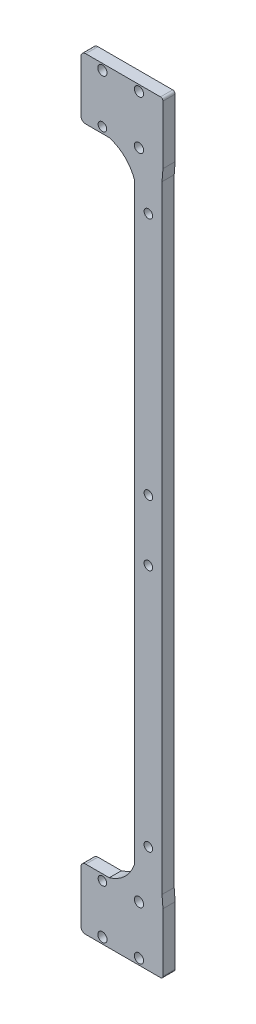
ISO-10303-21;
HEADER;
FILE_DESCRIPTION(('STEP AP214'),'2;1');
FILE_NAME('part.step','',(''),(''),'','','');
FILE_SCHEMA(('AUTOMOTIVE_DESIGN { 1 0 10303 214 1 1 1 1 }'));
ENDSEC;
DATA;
#1=APPLICATION_CONTEXT('core data for automotive mechanical design processes');
#2=APPLICATION_PROTOCOL_DEFINITION('international standard','automotive_design',2000,#1);
#3=PRODUCT_CONTEXT('',#1,'mechanical');
#4=PRODUCT('Part','Part','',(#3));
#5=PRODUCT_RELATED_PRODUCT_CATEGORY('part','',(#4));
#6=PRODUCT_DEFINITION_FORMATION('','',#4);
#7=PRODUCT_DEFINITION_CONTEXT('part definition',#1,'design');
#8=PRODUCT_DEFINITION('design','',#6,#7);
#9=PRODUCT_DEFINITION_SHAPE('','',#8);
#10=(LENGTH_UNIT() NAMED_UNIT(*) SI_UNIT(.MILLI.,.METRE.));
#11=(NAMED_UNIT(*) PLANE_ANGLE_UNIT() SI_UNIT($,.RADIAN.));
#12=(NAMED_UNIT(*) SI_UNIT($,.STERADIAN.) SOLID_ANGLE_UNIT());
#13=UNCERTAINTY_MEASURE_WITH_UNIT(LENGTH_MEASURE(1.E-05),#10,'distance_accuracy_value','');
#14=(GEOMETRIC_REPRESENTATION_CONTEXT(3) GLOBAL_UNCERTAINTY_ASSIGNED_CONTEXT((#13)) GLOBAL_UNIT_ASSIGNED_CONTEXT((#10,
#11,#12)) REPRESENTATION_CONTEXT('',''));
#15=CARTESIAN_POINT('',(0.,0.,0.));
#16=DIRECTION('',(0.,0.,1.));
#17=DIRECTION('',(1.,0.,0.));
#18=AXIS2_PLACEMENT_3D('',#15,#16,#17);
#19=CARTESIAN_POINT('',(3.,-10.5,5.));
#20=DIRECTION('',(0.,0.,1.));
#21=DIRECTION('',(1.,0.,0.));
#22=AXIS2_PLACEMENT_3D('',#19,#20,#21);
#23=PLANE('',#22);
#24=CARTESIAN_POINT('',(9.85,277.999999999941,5.));
#25=DIRECTION('',(0.,0.,1.));
#26=DIRECTION('',(-1.,0.,0.));
#27=AXIS2_PLACEMENT_3D('',#24,#25,#26);
#28=CIRCLE('',#27,1.75);
#29=CARTESIAN_POINT('',(8.1,277.999999999941,5.));
#30=VERTEX_POINT('',#29);
#31=EDGE_CURVE('E535',#30,#30,#28,.T.);
#32=ORIENTED_EDGE('',*,*,#31,.F.);
#33=EDGE_LOOP('',(#32));
#34=FACE_BOUND('',#33,.T.);
#35=CARTESIAN_POINT('',(24.85,297.999999999941,5.));
#36=DIRECTION('',(0.,0.,1.));
#37=DIRECTION('',(-1.,0.,0.));
#38=AXIS2_PLACEMENT_3D('',#35,#36,#37);
#39=CIRCLE('',#38,1.9);
#40=CARTESIAN_POINT('',(22.95,297.999999999941,5.));
#41=VERTEX_POINT('',#40);
#42=EDGE_CURVE('E523',#41,#41,#39,.T.);
#43=ORIENTED_EDGE('',*,*,#42,.F.);
#44=EDGE_LOOP('',(#43));
#45=FACE_BOUND('',#44,.T.);
#46=CARTESIAN_POINT('',(28.7000000000262,256.499999999971,5.));
#47=DIRECTION('',(0.,0.,1.));
#48=DIRECTION('',(1.,0.,0.));
#49=AXIS2_PLACEMENT_3D('',#46,#47,#48);
#50=CIRCLE('',#49,1.75000000000003);
#51=CARTESIAN_POINT('',(30.4500000000262,256.499999999971,5.));
#52=VERTEX_POINT('',#51);
#53=EDGE_CURVE('E511',#52,#52,#50,.T.);
#54=ORIENTED_EDGE('',*,*,#53,.F.);
#55=EDGE_LOOP('',(#54));
#56=FACE_BOUND('',#55,.T.);
#57=CARTESIAN_POINT('',(28.7000000000262,131.499999999971,5.));
#58=DIRECTION('',(0.,0.,1.));
#59=DIRECTION('',(1.,0.,0.));
#60=AXIS2_PLACEMENT_3D('',#57,#58,#59);
#61=CIRCLE('',#60,1.75000000000003);
#62=CARTESIAN_POINT('',(30.4500000000262,131.499999999971,5.));
#63=VERTEX_POINT('',#62);
#64=EDGE_CURVE('E499',#63,#63,#61,.T.);
#65=ORIENTED_EDGE('',*,*,#64,.F.);
#66=EDGE_LOOP('',(#65));
#67=FACE_BOUND('',#66,.T.);
#68=CARTESIAN_POINT('',(24.85,10.,5.));
#69=DIRECTION('',(0.,0.,1.));
#70=DIRECTION('',(1.,0.,0.));
#71=AXIS2_PLACEMENT_3D('',#68,#69,#70);
#72=CIRCLE('',#71,1.9);
#73=CARTESIAN_POINT('',(26.75,10.,5.));
#74=VERTEX_POINT('',#73);
#75=EDGE_CURVE('E487',#74,#74,#72,.T.);
#76=ORIENTED_EDGE('',*,*,#75,.F.);
#77=EDGE_LOOP('',(#76));
#78=FACE_BOUND('',#77,.T.);
#79=CARTESIAN_POINT('',(9.85,-10.,5.));
#80=DIRECTION('',(0.,0.,1.));
#81=DIRECTION('',(1.,0.,0.));
#82=AXIS2_PLACEMENT_3D('',#79,#80,#81);
#83=CIRCLE('',#82,1.9);
#84=CARTESIAN_POINT('',(11.75,-10.,5.));
#85=VERTEX_POINT('',#84);
#86=EDGE_CURVE('E210',#85,#85,#83,.T.);
#87=ORIENTED_EDGE('',*,*,#86,.F.);
#88=EDGE_LOOP('',(#87));
#89=FACE_BOUND('',#88,.T.);
#90=CARTESIAN_POINT('',(3.,-10.5,5.));
#91=DIRECTION('',(0.,0.,1.));
#92=DIRECTION('',(1.,0.,0.));
#93=AXIS2_PLACEMENT_3D('',#90,#91,#92);
#94=CIRCLE('',#93,2.);
#95=CARTESIAN_POINT('',(1.,-10.5,5.));
#96=VERTEX_POINT('',#95);
#97=CARTESIAN_POINT('',(3.00000000000002,-12.5,5.));
#98=VERTEX_POINT('',#97);
#99=EDGE_CURVE('E266',#96,#98,#94,.T.);
#100=ORIENTED_EDGE('',*,*,#99,.T.);
#101=DIRECTION('',(1.,0.,0.));
#102=VECTOR('',#101,1.);
#103=CARTESIAN_POINT('',(3.00000000000002,-12.5,5.));
#104=LINE('',#103,#102);
#105=CARTESIAN_POINT('',(33.7000000000005,-12.5,5.));
#106=VERTEX_POINT('',#105);
#107=EDGE_CURVE('E133',#98,#106,#104,.T.);
#108=ORIENTED_EDGE('',*,*,#107,.T.);
#109=CARTESIAN_POINT('',(33.7000000000005,-11.5,5.));
#110=DIRECTION('',(0.,0.,1.));
#111=DIRECTION('',(1.,0.,0.));
#112=AXIS2_PLACEMENT_3D('',#109,#110,#111);
#113=CIRCLE('',#112,1.);
#114=CARTESIAN_POINT('',(34.7000000000005,-11.5,5.));
#115=VERTEX_POINT('',#114);
#116=EDGE_CURVE('E317',#106,#115,#113,.T.);
#117=ORIENTED_EDGE('',*,*,#116,.T.);
#118=DIRECTION('',(0.,1.,0.));
#119=VECTOR('',#118,1.);
#120=CARTESIAN_POINT('',(34.7000000000005,-11.5,5.));
#121=LINE('',#120,#119);
#122=CARTESIAN_POINT('',(34.7000000000005,12.5,5.));
#123=VERTEX_POINT('',#122);
#124=EDGE_CURVE('E336',#115,#123,#121,.T.);
#125=ORIENTED_EDGE('',*,*,#124,.T.);
#126=CARTESIAN_POINT('',(34.7000000000005,12.5,5.));
#127=CARTESIAN_POINT('',(34.5297551286038,14.9265737239288,5.));
#128=CARTESIAN_POINT('',(34.3000000000262,17.3483091822442,5.));
#129=B_SPLINE_CURVE_WITH_KNOTS('',2,(#126,#127,#128),.UNSPECIFIED.,.F.,.F.,(3,3),(0.,1.),.UNSPECIFIED.);
#130=CARTESIAN_POINT('',(34.3000000000262,17.3483091822442,5.));
#131=VERTEX_POINT('',#130);
#132=EDGE_CURVE('E333',#123,#131,#129,.T.);
#133=ORIENTED_EDGE('',*,*,#132,.T.);
#134=DIRECTION('',(0.,1.,0.));
#135=VECTOR('',#134,1.);
#136=CARTESIAN_POINT('',(34.3000000000262,17.3483091822442,5.));
#137=LINE('',#136,#135);
#138=CARTESIAN_POINT('',(34.3000000000262,270.651690817697,5.));
#139=VERTEX_POINT('',#138);
#140=EDGE_CURVE('E335',#131,#139,#137,.T.);
#141=ORIENTED_EDGE('',*,*,#140,.T.);
#142=CARTESIAN_POINT('',(34.3000000000262,270.651690817697,5.));
#143=CARTESIAN_POINT('',(34.5297551286038,273.073426276012,5.));
#144=CARTESIAN_POINT('',(34.7000000000005,275.499999999941,5.));
#145=B_SPLINE_CURVE_WITH_KNOTS('',2,(#142,#143,#144),.UNSPECIFIED.,.F.,.F.,(3,3),(0.,1.),.UNSPECIFIED.);
#146=CARTESIAN_POINT('',(34.7000000000005,275.499999999941,5.));
#147=VERTEX_POINT('',#146);
#148=EDGE_CURVE('E338',#139,#147,#145,.T.);
#149=ORIENTED_EDGE('',*,*,#148,.T.);
#150=DIRECTION('',(0.,1.,0.));
#151=VECTOR('',#150,1.);
#152=CARTESIAN_POINT('',(34.7000000000005,299.499999999941,5.));
#153=LINE('',#152,#151);
#154=CARTESIAN_POINT('',(34.7000000000005,299.499999999941,5.));
#155=VERTEX_POINT('',#154);
#156=EDGE_CURVE('E447',#147,#155,#153,.T.);
#157=ORIENTED_EDGE('',*,*,#156,.T.);
#158=CARTESIAN_POINT('',(33.7000000000005,299.499999999941,5.));
#159=DIRECTION('',(0.,0.,1.));
#160=DIRECTION('',(1.,0.,0.));
#161=AXIS2_PLACEMENT_3D('',#158,#159,#160);
#162=CIRCLE('',#161,1.);
#163=CARTESIAN_POINT('',(33.7000000000005,300.499999999941,5.));
#164=VERTEX_POINT('',#163);
#165=EDGE_CURVE('E452',#155,#164,#162,.T.);
#166=ORIENTED_EDGE('',*,*,#165,.T.);
#167=DIRECTION('',(-1.,0.,0.));
#168=VECTOR('',#167,1.);
#169=CARTESIAN_POINT('',(22.7000000000005,300.499999999941,5.));
#170=LINE('',#169,#168);
#171=CARTESIAN_POINT('',(3.00000000000001,300.499999999941,5.));
#172=VERTEX_POINT('',#171);
#173=EDGE_CURVE('E454',#164,#172,#170,.T.);
#174=ORIENTED_EDGE('',*,*,#173,.T.);
#175=CARTESIAN_POINT('',(3.,298.499999999941,5.));
#176=DIRECTION('',(0.,0.,1.));
#177=DIRECTION('',(-1.,0.,0.));
#178=AXIS2_PLACEMENT_3D('',#175,#176,#177);
#179=CIRCLE('',#178,2.);
#180=CARTESIAN_POINT('',(1.,298.499999999941,5.));
#181=VERTEX_POINT('',#180);
#182=EDGE_CURVE('E456',#172,#181,#179,.T.);
#183=ORIENTED_EDGE('',*,*,#182,.T.);
#184=DIRECTION('',(0.,-1.,0.));
#185=VECTOR('',#184,1.);
#186=CARTESIAN_POINT('',(1.,277.499999999941,5.));
#187=LINE('',#186,#185);
#188=CARTESIAN_POINT('',(1.,277.499999999941,5.));
#189=VERTEX_POINT('',#188);
#190=EDGE_CURVE('E458',#181,#189,#187,.T.);
#191=ORIENTED_EDGE('',*,*,#190,.T.);
#192=CARTESIAN_POINT('',(3.,277.499999999941,5.));
#193=DIRECTION('',(0.,0.,1.));
#194=DIRECTION('',(1.,0.,0.));
#195=AXIS2_PLACEMENT_3D('',#192,#193,#194);
#196=CIRCLE('',#195,2.);
#197=CARTESIAN_POINT('',(3.00000000000001,275.499999999941,5.));
#198=VERTEX_POINT('',#197);
#199=EDGE_CURVE('E459',#189,#198,#196,.T.);
#200=ORIENTED_EDGE('',*,*,#199,.T.);
#201=DIRECTION('',(1.,0.,0.));
#202=VECTOR('',#201,1.);
#203=CARTESIAN_POINT('',(12.6767713924258,275.499999999941,5.));
#204=LINE('',#203,#202);
#205=CARTESIAN_POINT('',(12.6767713924258,275.499999999941,5.));
#206=VERTEX_POINT('',#205);
#207=EDGE_CURVE('E404',#198,#206,#204,.T.);
#208=ORIENTED_EDGE('',*,*,#207,.T.);
#209=CARTESIAN_POINT('',(12.6767713924258,275.499999999941,5.));
#210=CARTESIAN_POINT('',(20.3360203808365,273.078870876621,5.));
#211=CARTESIAN_POINT('',(23.1000000000262,265.44764617422,5.));
#212=B_SPLINE_CURVE_WITH_KNOTS('',2,(#209,#210,#211),.UNSPECIFIED.,.F.,.F.,(3,3),(0.,1.),.UNSPECIFIED.);
#213=CARTESIAN_POINT('',(23.1000000000262,265.44764617422,5.));
#214=VERTEX_POINT('',#213);
#215=EDGE_CURVE('E399',#206,#214,#212,.T.);
#216=ORIENTED_EDGE('',*,*,#215,.T.);
#217=DIRECTION('',(0.,-1.,0.));
#218=VECTOR('',#217,1.);
#219=CARTESIAN_POINT('',(23.1000000000262,265.44764617422,5.));
#220=LINE('',#219,#218);
#221=CARTESIAN_POINT('',(23.1000000000262,22.5523538257214,5.));
#222=VERTEX_POINT('',#221);
#223=EDGE_CURVE('E394',#214,#222,#220,.T.);
#224=ORIENTED_EDGE('',*,*,#223,.T.);
#225=CARTESIAN_POINT('',(23.1000000000262,22.5523538257214,5.));
#226=CARTESIAN_POINT('',(20.3360203808365,14.9211291233198,5.));
#227=CARTESIAN_POINT('',(12.6767713924258,12.5,5.));
#228=B_SPLINE_CURVE_WITH_KNOTS('',2,(#225,#226,#227),.UNSPECIFIED.,.F.,.F.,(3,3),(0.,1.),.UNSPECIFIED.);
#229=CARTESIAN_POINT('',(12.6767713924258,12.5,5.));
#230=VERTEX_POINT('',#229);
#231=EDGE_CURVE('E188',#222,#230,#228,.T.);
#232=ORIENTED_EDGE('',*,*,#231,.T.);
#233=DIRECTION('',(-1.,0.,0.));
#234=VECTOR('',#233,1.);
#235=CARTESIAN_POINT('',(12.6767713924258,12.5,5.));
#236=LINE('',#235,#234);
#237=CARTESIAN_POINT('',(3.00000000000001,12.5,5.));
#238=VERTEX_POINT('',#237);
#239=EDGE_CURVE('E182',#230,#238,#236,.T.);
#240=ORIENTED_EDGE('',*,*,#239,.T.);
#241=CARTESIAN_POINT('',(3.,10.5,5.));
#242=DIRECTION('',(0.,0.,1.));
#243=DIRECTION('',(-1.,0.,0.));
#244=AXIS2_PLACEMENT_3D('',#241,#242,#243);
#245=CIRCLE('',#244,2.);
#246=CARTESIAN_POINT('',(1.,10.5,5.));
#247=VERTEX_POINT('',#246);
#248=EDGE_CURVE('E186',#238,#247,#245,.T.);
#249=ORIENTED_EDGE('',*,*,#248,.T.);
#250=DIRECTION('',(0.,-1.,0.));
#251=VECTOR('',#250,1.);
#252=CARTESIAN_POINT('',(1.,10.5,5.));
#253=LINE('',#252,#251);
#254=EDGE_CURVE('E54',#247,#96,#253,.T.);
#255=ORIENTED_EDGE('',*,*,#254,.T.);
#256=EDGE_LOOP('',(#100,#108,#117,#125,#133,#141,#149,#157,#166,#174,#183,#191,#200,#208,#216,
#224,#232,#240,#249,#255));
#257=FACE_BOUND('',#256,.T.);
#258=CARTESIAN_POINT('',(9.85,10.,5.));
#259=DIRECTION('',(0.,0.,1.));
#260=DIRECTION('',(1.,0.,0.));
#261=AXIS2_PLACEMENT_3D('',#258,#259,#260);
#262=CIRCLE('',#261,1.75);
#263=CARTESIAN_POINT('',(11.6,10.,5.));
#264=VERTEX_POINT('',#263);
#265=EDGE_CURVE('E481',#264,#264,#262,.T.);
#266=ORIENTED_EDGE('',*,*,#265,.F.);
#267=EDGE_LOOP('',(#266));
#268=FACE_BOUND('',#267,.T.);
#269=CARTESIAN_POINT('',(24.85,-10.,5.));
#270=DIRECTION('',(0.,0.,1.));
#271=DIRECTION('',(1.,0.,0.));
#272=AXIS2_PLACEMENT_3D('',#269,#270,#271);
#273=CIRCLE('',#272,1.9);
#274=CARTESIAN_POINT('',(26.75,-10.,5.));
#275=VERTEX_POINT('',#274);
#276=EDGE_CURVE('E493',#275,#275,#273,.T.);
#277=ORIENTED_EDGE('',*,*,#276,.F.);
#278=EDGE_LOOP('',(#277));
#279=FACE_BOUND('',#278,.T.);
#280=CARTESIAN_POINT('',(28.7000000000262,156.499999999971,5.));
#281=DIRECTION('',(0.,0.,1.));
#282=DIRECTION('',(1.,0.,0.));
#283=AXIS2_PLACEMENT_3D('',#280,#281,#282);
#284=CIRCLE('',#283,1.75);
#285=CARTESIAN_POINT('',(30.4500000000262,156.499999999971,5.));
#286=VERTEX_POINT('',#285);
#287=EDGE_CURVE('E505',#286,#286,#284,.T.);
#288=ORIENTED_EDGE('',*,*,#287,.F.);
#289=EDGE_LOOP('',(#288));
#290=FACE_BOUND('',#289,.T.);
#291=CARTESIAN_POINT('',(28.7000000000262,31.4999999999709,5.));
#292=DIRECTION('',(0.,0.,1.));
#293=DIRECTION('',(1.,0.,0.));
#294=AXIS2_PLACEMENT_3D('',#291,#292,#293);
#295=CIRCLE('',#294,1.75);
#296=CARTESIAN_POINT('',(30.4500000000262,31.4999999999709,5.));
#297=VERTEX_POINT('',#296);
#298=EDGE_CURVE('E517',#297,#297,#295,.T.);
#299=ORIENTED_EDGE('',*,*,#298,.F.);
#300=EDGE_LOOP('',(#299));
#301=FACE_BOUND('',#300,.T.);
#302=CARTESIAN_POINT('',(24.85,277.999999999941,5.));
#303=DIRECTION('',(0.,0.,1.));
#304=DIRECTION('',(-1.,0.,0.));
#305=AXIS2_PLACEMENT_3D('',#302,#303,#304);
#306=CIRCLE('',#305,1.89999999999999);
#307=CARTESIAN_POINT('',(22.95,277.999999999941,5.));
#308=VERTEX_POINT('',#307);
#309=EDGE_CURVE('E529',#308,#308,#306,.T.);
#310=ORIENTED_EDGE('',*,*,#309,.F.);
#311=EDGE_LOOP('',(#310));
#312=FACE_BOUND('',#311,.T.);
#313=CARTESIAN_POINT('',(9.85,297.999999999941,5.));
#314=DIRECTION('',(0.,0.,1.));
#315=DIRECTION('',(-1.,0.,0.));
#316=AXIS2_PLACEMENT_3D('',#313,#314,#315);
#317=CIRCLE('',#316,1.9);
#318=CARTESIAN_POINT('',(7.95,297.999999999941,5.));
#319=VERTEX_POINT('',#318);
#320=EDGE_CURVE('E541',#319,#319,#317,.T.);
#321=ORIENTED_EDGE('',*,*,#320,.F.);
#322=EDGE_LOOP('',(#321));
#323=FACE_BOUND('',#322,.T.);
#324=ADVANCED_FACE('F37',(#34,#45,#56,#67,#78,#89,#257,#268,#279,#290,#301,#312,#323),#23,.T.);
#325=CARTESIAN_POINT('',(3.,-10.5,0.));
#326=DIRECTION('',(0.,0.,1.));
#327=DIRECTION('',(1.,0.,0.));
#328=AXIS2_PLACEMENT_3D('',#325,#326,#327);
#329=PLANE('',#328);
#330=CARTESIAN_POINT('',(3.,-10.5,0.));
#331=DIRECTION('',(0.,0.,1.));
#332=DIRECTION('',(1.,0.,0.));
#333=AXIS2_PLACEMENT_3D('',#330,#331,#332);
#334=CIRCLE('',#333,2.);
#335=CARTESIAN_POINT('',(1.,-10.5,0.));
#336=VERTEX_POINT('',#335);
#337=CARTESIAN_POINT('',(3.00000000000002,-12.5,0.));
#338=VERTEX_POINT('',#337);
#339=EDGE_CURVE('E206',#336,#338,#334,.T.);
#340=ORIENTED_EDGE('',*,*,#339,.F.);
#341=DIRECTION('',(0.,-1.,0.));
#342=VECTOR('',#341,1.);
#343=CARTESIAN_POINT('',(1.,10.5,0.));
#344=LINE('',#343,#342);
#345=CARTESIAN_POINT('',(1.,10.5,0.));
#346=VERTEX_POINT('',#345);
#347=EDGE_CURVE('E125',#346,#336,#344,.T.);
#348=ORIENTED_EDGE('',*,*,#347,.F.);
#349=CARTESIAN_POINT('',(3.,10.5,0.));
#350=DIRECTION('',(0.,0.,1.));
#351=DIRECTION('',(-1.,0.,0.));
#352=AXIS2_PLACEMENT_3D('',#349,#350,#351);
#353=CIRCLE('',#352,2.);
#354=CARTESIAN_POINT('',(3.00000000000001,12.5,0.));
#355=VERTEX_POINT('',#354);
#356=EDGE_CURVE('E119',#355,#346,#353,.T.);
#357=ORIENTED_EDGE('',*,*,#356,.F.);
#358=DIRECTION('',(-1.,0.,0.));
#359=VECTOR('',#358,1.);
#360=CARTESIAN_POINT('',(12.6767713924258,12.5,0.));
#361=LINE('',#360,#359);
#362=CARTESIAN_POINT('',(12.6767713924258,12.5,0.));
#363=VERTEX_POINT('',#362);
#364=EDGE_CURVE('E196',#363,#355,#361,.T.);
#365=ORIENTED_EDGE('',*,*,#364,.F.);
#366=CARTESIAN_POINT('',(23.1000000000262,22.5523538257214,0.));
#367=CARTESIAN_POINT('',(20.3360203808365,14.9211291233198,0.));
#368=CARTESIAN_POINT('',(12.6767713924258,12.5,0.));
#369=B_SPLINE_CURVE_WITH_KNOTS('',2,(#366,#367,#368),.UNSPECIFIED.,.F.,.F.,(3,3),(0.,1.),.UNSPECIFIED.);
#370=CARTESIAN_POINT('',(23.1000000000262,22.5523538257214,0.));
#371=VERTEX_POINT('',#370);
#372=EDGE_CURVE('E256',#371,#363,#369,.T.);
#373=ORIENTED_EDGE('',*,*,#372,.F.);
#374=DIRECTION('',(0.,-1.,0.));
#375=VECTOR('',#374,1.);
#376=CARTESIAN_POINT('',(23.1000000000262,265.44764617422,0.));
#377=LINE('',#376,#375);
#378=CARTESIAN_POINT('',(23.1000000000262,265.44764617422,0.));
#379=VERTEX_POINT('',#378);
#380=EDGE_CURVE('E251',#379,#371,#377,.T.);
#381=ORIENTED_EDGE('',*,*,#380,.F.);
#382=CARTESIAN_POINT('',(12.6767713924258,275.499999999941,0.));
#383=CARTESIAN_POINT('',(20.3360203808365,273.078870876621,0.));
#384=CARTESIAN_POINT('',(23.1000000000262,265.44764617422,0.));
#385=B_SPLINE_CURVE_WITH_KNOTS('',2,(#382,#383,#384),.UNSPECIFIED.,.F.,.F.,(3,3),(0.,1.),.UNSPECIFIED.);
#386=CARTESIAN_POINT('',(12.6767713924258,275.499999999941,0.));
#387=VERTEX_POINT('',#386);
#388=EDGE_CURVE('E247',#387,#379,#385,.T.);
#389=ORIENTED_EDGE('',*,*,#388,.F.);
#390=DIRECTION('',(1.,0.,0.));
#391=VECTOR('',#390,1.);
#392=CARTESIAN_POINT('',(12.6767713924258,275.499999999941,0.));
#393=LINE('',#392,#391);
#394=CARTESIAN_POINT('',(3.00000000000001,275.499999999941,0.));
#395=VERTEX_POINT('',#394);
#396=EDGE_CURVE('E245',#395,#387,#393,.T.);
#397=ORIENTED_EDGE('',*,*,#396,.F.);
#398=CARTESIAN_POINT('',(3.,277.499999999941,0.));
#399=DIRECTION('',(0.,0.,1.));
#400=DIRECTION('',(1.,0.,0.));
#401=AXIS2_PLACEMENT_3D('',#398,#399,#400);
#402=CIRCLE('',#401,2.);
#403=CARTESIAN_POINT('',(1.,277.499999999941,0.));
#404=VERTEX_POINT('',#403);
#405=EDGE_CURVE('E243',#404,#395,#402,.T.);
#406=ORIENTED_EDGE('',*,*,#405,.F.);
#407=DIRECTION('',(0.,-1.,0.));
#408=VECTOR('',#407,1.);
#409=CARTESIAN_POINT('',(1.,277.499999999941,0.));
#410=LINE('',#409,#408);
#411=CARTESIAN_POINT('',(1.,298.499999999941,0.));
#412=VERTEX_POINT('',#411);
#413=EDGE_CURVE('E241',#412,#404,#410,.T.);
#414=ORIENTED_EDGE('',*,*,#413,.F.);
#415=CARTESIAN_POINT('',(3.,298.499999999941,0.));
#416=DIRECTION('',(0.,0.,1.));
#417=DIRECTION('',(-1.,0.,0.));
#418=AXIS2_PLACEMENT_3D('',#415,#416,#417);
#419=CIRCLE('',#418,2.);
#420=CARTESIAN_POINT('',(3.00000000000001,300.499999999941,0.));
#421=VERTEX_POINT('',#420);
#422=EDGE_CURVE('E239',#421,#412,#419,.T.);
#423=ORIENTED_EDGE('',*,*,#422,.F.);
#424=DIRECTION('',(-1.,0.,0.));
#425=VECTOR('',#424,1.);
#426=CARTESIAN_POINT('',(3.00000000000002,300.499999999941,0.));
#427=LINE('',#426,#425);
#428=CARTESIAN_POINT('',(33.7000000000005,300.499999999941,0.));
#429=VERTEX_POINT('',#428);
#430=EDGE_CURVE('E237',#429,#421,#427,.T.);
#431=ORIENTED_EDGE('',*,*,#430,.F.);
#432=CARTESIAN_POINT('',(33.7000000000005,299.499999999941,0.));
#433=DIRECTION('',(0.,0.,1.));
#434=DIRECTION('',(1.,0.,0.));
#435=AXIS2_PLACEMENT_3D('',#432,#433,#434);
#436=CIRCLE('',#435,1.);
#437=CARTESIAN_POINT('',(34.7000000000005,299.499999999941,0.));
#438=VERTEX_POINT('',#437);
#439=EDGE_CURVE('E234',#438,#429,#436,.T.);
#440=ORIENTED_EDGE('',*,*,#439,.F.);
#441=DIRECTION('',(0.,1.,0.));
#442=VECTOR('',#441,1.);
#443=CARTESIAN_POINT('',(34.7000000000005,299.499999999941,0.));
#444=LINE('',#443,#442);
#445=CARTESIAN_POINT('',(34.7000000000005,275.499999999941,0.));
#446=VERTEX_POINT('',#445);
#447=EDGE_CURVE('E229',#446,#438,#444,.T.);
#448=ORIENTED_EDGE('',*,*,#447,.F.);
#449=CARTESIAN_POINT('',(34.3000000000262,270.651690817697,0.));
#450=CARTESIAN_POINT('',(34.5297551286038,273.073426276012,0.));
#451=CARTESIAN_POINT('',(34.7000000000005,275.499999999941,0.));
#452=B_SPLINE_CURVE_WITH_KNOTS('',2,(#449,#450,#451),.UNSPECIFIED.,.F.,.F.,(3,3),(0.,1.),.UNSPECIFIED.);
#453=CARTESIAN_POINT('',(34.3000000000262,270.651690817697,0.));
#454=VERTEX_POINT('',#453);
#455=EDGE_CURVE('E225',#454,#446,#452,.T.);
#456=ORIENTED_EDGE('',*,*,#455,.F.);
#457=DIRECTION('',(0.,1.,0.));
#458=VECTOR('',#457,1.);
#459=CARTESIAN_POINT('',(34.3000000000262,17.3483091822442,0.));
#460=LINE('',#459,#458);
#461=CARTESIAN_POINT('',(34.3000000000262,17.3483091822442,0.));
#462=VERTEX_POINT('',#461);
#463=EDGE_CURVE('E220',#462,#454,#460,.T.);
#464=ORIENTED_EDGE('',*,*,#463,.F.);
#465=CARTESIAN_POINT('',(34.7000000000005,12.5,0.));
#466=CARTESIAN_POINT('',(34.5297551286038,14.9265737239288,0.));
#467=CARTESIAN_POINT('',(34.3000000000262,17.3483091822442,0.));
#468=B_SPLINE_CURVE_WITH_KNOTS('',2,(#465,#466,#467),.UNSPECIFIED.,.F.,.F.,(3,3),(0.,1.),.UNSPECIFIED.);
#469=CARTESIAN_POINT('',(34.7000000000005,12.5,0.));
#470=VERTEX_POINT('',#469);
#471=EDGE_CURVE('E216',#470,#462,#468,.T.);
#472=ORIENTED_EDGE('',*,*,#471,.F.);
#473=DIRECTION('',(0.,1.,0.));
#474=VECTOR('',#473,1.);
#475=CARTESIAN_POINT('',(34.7000000000005,-11.5,0.));
#476=LINE('',#475,#474);
#477=CARTESIAN_POINT('',(34.7000000000005,-11.5,0.));
#478=VERTEX_POINT('',#477);
#479=EDGE_CURVE('E214',#478,#470,#476,.T.);
#480=ORIENTED_EDGE('',*,*,#479,.F.);
#481=CARTESIAN_POINT('',(33.7000000000005,-11.5,0.));
#482=DIRECTION('',(0.,0.,1.));
#483=DIRECTION('',(1.,0.,0.));
#484=AXIS2_PLACEMENT_3D('',#481,#482,#483);
#485=CIRCLE('',#484,1.);
#486=CARTESIAN_POINT('',(33.7000000000005,-12.5,0.));
#487=VERTEX_POINT('',#486);
#488=EDGE_CURVE('E212',#487,#478,#485,.T.);
#489=ORIENTED_EDGE('',*,*,#488,.F.);
#490=DIRECTION('',(1.,0.,0.));
#491=VECTOR('',#490,1.);
#492=CARTESIAN_POINT('',(22.7000000000005,-12.5,0.));
#493=LINE('',#492,#491);
#494=EDGE_CURVE('E209',#338,#487,#493,.T.);
#495=ORIENTED_EDGE('',*,*,#494,.F.);
#496=EDGE_LOOP('',(#340,#348,#357,#365,#373,#381,#389,#397,#406,#414,#423,#431,#440,#448,#456,
#464,#472,#480,#489,#495));
#497=FACE_BOUND('',#496,.T.);
#498=CARTESIAN_POINT('',(9.85,-10.,0.));
#499=DIRECTION('',(0.,0.,1.));
#500=DIRECTION('',(1.,0.,0.));
#501=AXIS2_PLACEMENT_3D('',#498,#499,#500);
#502=CIRCLE('',#501,1.9);
#503=CARTESIAN_POINT('',(11.75,-10.,0.));
#504=VERTEX_POINT('',#503);
#505=EDGE_CURVE('E478',#504,#504,#502,.T.);
#506=ORIENTED_EDGE('',*,*,#505,.T.);
#507=EDGE_LOOP('',(#506));
#508=FACE_BOUND('',#507,.T.);
#509=CARTESIAN_POINT('',(9.85,10.,0.));
#510=DIRECTION('',(0.,0.,1.));
#511=DIRECTION('',(1.,0.,0.));
#512=AXIS2_PLACEMENT_3D('',#509,#510,#511);
#513=CIRCLE('',#512,1.75);
#514=CARTESIAN_POINT('',(11.6,10.,0.));
#515=VERTEX_POINT('',#514);
#516=EDGE_CURVE('E484',#515,#515,#513,.T.);
#517=ORIENTED_EDGE('',*,*,#516,.T.);
#518=EDGE_LOOP('',(#517));
#519=FACE_BOUND('',#518,.T.);
#520=CARTESIAN_POINT('',(24.85,10.,0.));
#521=DIRECTION('',(0.,0.,1.));
#522=DIRECTION('',(1.,0.,0.));
#523=AXIS2_PLACEMENT_3D('',#520,#521,#522);
#524=CIRCLE('',#523,1.9);
#525=CARTESIAN_POINT('',(26.75,10.,0.));
#526=VERTEX_POINT('',#525);
#527=EDGE_CURVE('E490',#526,#526,#524,.T.);
#528=ORIENTED_EDGE('',*,*,#527,.T.);
#529=EDGE_LOOP('',(#528));
#530=FACE_BOUND('',#529,.T.);
#531=CARTESIAN_POINT('',(24.85,-10.,0.));
#532=DIRECTION('',(0.,0.,1.));
#533=DIRECTION('',(1.,0.,0.));
#534=AXIS2_PLACEMENT_3D('',#531,#532,#533);
#535=CIRCLE('',#534,1.9);
#536=CARTESIAN_POINT('',(26.75,-10.,0.));
#537=VERTEX_POINT('',#536);
#538=EDGE_CURVE('E496',#537,#537,#535,.T.);
#539=ORIENTED_EDGE('',*,*,#538,.T.);
#540=EDGE_LOOP('',(#539));
#541=FACE_BOUND('',#540,.T.);
#542=CARTESIAN_POINT('',(28.7000000000262,131.499999999971,0.));
#543=DIRECTION('',(0.,0.,1.));
#544=DIRECTION('',(1.,0.,0.));
#545=AXIS2_PLACEMENT_3D('',#542,#543,#544);
#546=CIRCLE('',#545,1.75000000000003);
#547=CARTESIAN_POINT('',(30.4500000000262,131.499999999971,0.));
#548=VERTEX_POINT('',#547);
#549=EDGE_CURVE('E502',#548,#548,#546,.T.);
#550=ORIENTED_EDGE('',*,*,#549,.T.);
#551=EDGE_LOOP('',(#550));
#552=FACE_BOUND('',#551,.T.);
#553=CARTESIAN_POINT('',(28.7000000000262,156.499999999971,0.));
#554=DIRECTION('',(0.,0.,1.));
#555=DIRECTION('',(1.,0.,0.));
#556=AXIS2_PLACEMENT_3D('',#553,#554,#555);
#557=CIRCLE('',#556,1.75);
#558=CARTESIAN_POINT('',(30.4500000000262,156.499999999971,0.));
#559=VERTEX_POINT('',#558);
#560=EDGE_CURVE('E508',#559,#559,#557,.T.);
#561=ORIENTED_EDGE('',*,*,#560,.T.);
#562=EDGE_LOOP('',(#561));
#563=FACE_BOUND('',#562,.T.);
#564=CARTESIAN_POINT('',(28.7000000000262,256.499999999971,0.));
#565=DIRECTION('',(0.,0.,1.));
#566=DIRECTION('',(1.,0.,0.));
#567=AXIS2_PLACEMENT_3D('',#564,#565,#566);
#568=CIRCLE('',#567,1.75000000000003);
#569=CARTESIAN_POINT('',(30.4500000000262,256.499999999971,0.));
#570=VERTEX_POINT('',#569);
#571=EDGE_CURVE('E514',#570,#570,#568,.T.);
#572=ORIENTED_EDGE('',*,*,#571,.T.);
#573=EDGE_LOOP('',(#572));
#574=FACE_BOUND('',#573,.T.);
#575=CARTESIAN_POINT('',(28.7000000000262,31.4999999999709,0.));
#576=DIRECTION('',(0.,0.,1.));
#577=DIRECTION('',(1.,0.,0.));
#578=AXIS2_PLACEMENT_3D('',#575,#576,#577);
#579=CIRCLE('',#578,1.75);
#580=CARTESIAN_POINT('',(30.4500000000262,31.4999999999709,0.));
#581=VERTEX_POINT('',#580);
#582=EDGE_CURVE('E520',#581,#581,#579,.T.);
#583=ORIENTED_EDGE('',*,*,#582,.T.);
#584=EDGE_LOOP('',(#583));
#585=FACE_BOUND('',#584,.T.);
#586=CARTESIAN_POINT('',(24.85,297.999999999941,0.));
#587=DIRECTION('',(0.,0.,1.));
#588=DIRECTION('',(-1.,0.,0.));
#589=AXIS2_PLACEMENT_3D('',#586,#587,#588);
#590=CIRCLE('',#589,1.9);
#591=CARTESIAN_POINT('',(22.95,297.999999999941,0.));
#592=VERTEX_POINT('',#591);
#593=EDGE_CURVE('E526',#592,#592,#590,.T.);
#594=ORIENTED_EDGE('',*,*,#593,.T.);
#595=EDGE_LOOP('',(#594));
#596=FACE_BOUND('',#595,.T.);
#597=CARTESIAN_POINT('',(24.85,277.999999999941,0.));
#598=DIRECTION('',(0.,0.,1.));
#599=DIRECTION('',(-1.,0.,0.));
#600=AXIS2_PLACEMENT_3D('',#597,#598,#599);
#601=CIRCLE('',#600,1.89999999999999);
#602=CARTESIAN_POINT('',(22.95,277.999999999941,0.));
#603=VERTEX_POINT('',#602);
#604=EDGE_CURVE('E532',#603,#603,#601,.T.);
#605=ORIENTED_EDGE('',*,*,#604,.T.);
#606=EDGE_LOOP('',(#605));
#607=FACE_BOUND('',#606,.T.);
#608=CARTESIAN_POINT('',(9.85,277.999999999941,0.));
#609=DIRECTION('',(0.,0.,1.));
#610=DIRECTION('',(-1.,0.,0.));
#611=AXIS2_PLACEMENT_3D('',#608,#609,#610);
#612=CIRCLE('',#611,1.75);
#613=CARTESIAN_POINT('',(8.1,277.999999999941,0.));
#614=VERTEX_POINT('',#613);
#615=EDGE_CURVE('E538',#614,#614,#612,.T.);
#616=ORIENTED_EDGE('',*,*,#615,.T.);
#617=EDGE_LOOP('',(#616));
#618=FACE_BOUND('',#617,.T.);
#619=CARTESIAN_POINT('',(9.85,297.999999999941,0.));
#620=DIRECTION('',(0.,0.,1.));
#621=DIRECTION('',(-1.,0.,0.));
#622=AXIS2_PLACEMENT_3D('',#619,#620,#621);
#623=CIRCLE('',#622,1.9);
#624=CARTESIAN_POINT('',(7.95,297.999999999941,0.));
#625=VERTEX_POINT('',#624);
#626=EDGE_CURVE('E544',#625,#625,#623,.T.);
#627=ORIENTED_EDGE('',*,*,#626,.T.);
#628=EDGE_LOOP('',(#627));
#629=FACE_BOUND('',#628,.T.);
#630=ADVANCED_FACE('F321',(#497,#508,#519,#530,#541,#552,#563,#574,#585,#596,#607,#618,#629),
#329,.F.);
#631=CARTESIAN_POINT('',(3.,-10.5,5.));
#632=DIRECTION('',(0.,0.,-1.));
#633=DIRECTION('',(-1.,0.,0.));
#634=AXIS2_PLACEMENT_3D('',#631,#632,#633);
#635=CYLINDRICAL_SURFACE('',#634,2.);
#636=ORIENTED_EDGE('',*,*,#339,.T.);
#637=DIRECTION('',(0.,0.,-1.));
#638=VECTOR('',#637,1.);
#639=CARTESIAN_POINT('',(3.00000000000002,-12.5,5.));
#640=LINE('',#639,#638);
#641=EDGE_CURVE('E11',#98,#338,#640,.T.);
#642=ORIENTED_EDGE('',*,*,#641,.F.);
#643=ORIENTED_EDGE('',*,*,#99,.F.);
#644=DIRECTION('',(0.,0.,-1.));
#645=VECTOR('',#644,1.);
#646=CARTESIAN_POINT('',(1.,-10.5,5.));
#647=LINE('',#646,#645);
#648=EDGE_CURVE('E202',#96,#336,#647,.T.);
#649=ORIENTED_EDGE('',*,*,#648,.T.);
#650=EDGE_LOOP('',(#636,#642,#643,#649));
#651=FACE_BOUND('',#650,.T.);
#652=ADVANCED_FACE('F39',(#651),#635,.T.);
#653=CARTESIAN_POINT('',(22.7000000000005,-12.5,5.));
#654=DIRECTION('',(0.,1.,0.));
#655=DIRECTION('',(0.,0.,1.));
#656=AXIS2_PLACEMENT_3D('',#653,#654,#655);
#657=PLANE('',#656);
#658=ORIENTED_EDGE('',*,*,#494,.T.);
#659=DIRECTION('',(0.,0.,-1.));
#660=VECTOR('',#659,1.);
#661=CARTESIAN_POINT('',(33.7000000000005,-12.5,5.));
#662=LINE('',#661,#660);
#663=EDGE_CURVE('E46',#106,#487,#662,.T.);
#664=ORIENTED_EDGE('',*,*,#663,.F.);
#665=ORIENTED_EDGE('',*,*,#107,.F.);
#666=ORIENTED_EDGE('',*,*,#641,.T.);
#667=EDGE_LOOP('',(#658,#664,#665,#666));
#668=FACE_BOUND('',#667,.T.);
#669=ADVANCED_FACE('F358',(#668),#657,.F.);
#670=CARTESIAN_POINT('',(33.7000000000005,-11.5,5.));
#671=DIRECTION('',(0.,0.,-1.));
#672=DIRECTION('',(-1.,0.,0.));
#673=AXIS2_PLACEMENT_3D('',#670,#671,#672);
#674=CYLINDRICAL_SURFACE('',#673,1.);
#675=ORIENTED_EDGE('',*,*,#488,.T.);
#676=DIRECTION('',(0.,0.,-1.));
#677=VECTOR('',#676,1.);
#678=CARTESIAN_POINT('',(34.7000000000005,-11.5,5.));
#679=LINE('',#678,#677);
#680=EDGE_CURVE('E309',#115,#478,#679,.T.);
#681=ORIENTED_EDGE('',*,*,#680,.F.);
#682=ORIENTED_EDGE('',*,*,#116,.F.);
#683=ORIENTED_EDGE('',*,*,#663,.T.);
#684=EDGE_LOOP('',(#675,#681,#682,#683));
#685=FACE_BOUND('',#684,.T.);
#686=ADVANCED_FACE('F315',(#685),#674,.T.);
#687=CARTESIAN_POINT('',(34.7000000000005,-11.5,5.));
#688=DIRECTION('',(-1.,0.,0.));
#689=DIRECTION('',(0.,0.,1.));
#690=AXIS2_PLACEMENT_3D('',#687,#688,#689);
#691=PLANE('',#690);
#692=ORIENTED_EDGE('',*,*,#479,.T.);
#693=DIRECTION('',(0.,0.,-1.));
#694=VECTOR('',#693,1.);
#695=CARTESIAN_POINT('',(34.7000000000005,12.5,5.));
#696=LINE('',#695,#694);
#697=EDGE_CURVE('E306',#123,#470,#696,.T.);
#698=ORIENTED_EDGE('',*,*,#697,.F.);
#699=ORIENTED_EDGE('',*,*,#124,.F.);
#700=ORIENTED_EDGE('',*,*,#680,.T.);
#701=EDGE_LOOP('',(#692,#698,#699,#700));
#702=FACE_BOUND('',#701,.T.);
#703=ADVANCED_FACE('F327',(#702),#691,.F.);
#704=DIRECTION('',(0.,0.,-1.));
#705=VECTOR('',#704,1.);
#706=SURFACE_OF_LINEAR_EXTRUSION('',#129,#705);
#707=ORIENTED_EDGE('',*,*,#471,.T.);
#708=DIRECTION('',(0.,0.,-1.));
#709=VECTOR('',#708,1.);
#710=CARTESIAN_POINT('',(34.3000000000262,17.3483091822442,5.));
#711=LINE('',#710,#709);
#712=EDGE_CURVE('E303',#131,#462,#711,.T.);
#713=ORIENTED_EDGE('',*,*,#712,.F.);
#714=ORIENTED_EDGE('',*,*,#132,.F.);
#715=ORIENTED_EDGE('',*,*,#697,.T.);
#716=EDGE_LOOP('',(#707,#713,#714,#715));
#717=FACE_BOUND('',#716,.T.);
#718=ADVANCED_FACE('F331',(#717),#706,.F.);
#719=CARTESIAN_POINT('',(34.3000000000262,17.3483091822442,5.));
#720=DIRECTION('',(-1.,0.,0.));
#721=DIRECTION('',(0.,0.,1.));
#722=AXIS2_PLACEMENT_3D('',#719,#720,#721);
#723=PLANE('',#722);
#724=ORIENTED_EDGE('',*,*,#463,.T.);
#725=DIRECTION('',(0.,0.,-1.));
#726=VECTOR('',#725,1.);
#727=CARTESIAN_POINT('',(34.3000000000262,270.651690817697,5.));
#728=LINE('',#727,#726);
#729=EDGE_CURVE('E300',#139,#454,#728,.T.);
#730=ORIENTED_EDGE('',*,*,#729,.F.);
#731=ORIENTED_EDGE('',*,*,#140,.F.);
#732=ORIENTED_EDGE('',*,*,#712,.T.);
#733=EDGE_LOOP('',(#724,#730,#731,#732));
#734=FACE_BOUND('',#733,.T.);
#735=ADVANCED_FACE('F353',(#734),#723,.F.);
#736=DIRECTION('',(0.,0.,-1.));
#737=VECTOR('',#736,1.);
#738=SURFACE_OF_LINEAR_EXTRUSION('',#145,#737);
#739=ORIENTED_EDGE('',*,*,#455,.T.);
#740=DIRECTION('',(0.,0.,-1.));
#741=VECTOR('',#740,1.);
#742=CARTESIAN_POINT('',(34.7000000000005,275.499999999941,5.));
#743=LINE('',#742,#741);
#744=EDGE_CURVE('E297',#147,#446,#743,.T.);
#745=ORIENTED_EDGE('',*,*,#744,.F.);
#746=ORIENTED_EDGE('',*,*,#148,.F.);
#747=ORIENTED_EDGE('',*,*,#729,.T.);
#748=EDGE_LOOP('',(#739,#745,#746,#747));
#749=FACE_BOUND('',#748,.T.);
#750=ADVANCED_FACE('F439',(#749),#738,.F.);
#751=CARTESIAN_POINT('',(34.7000000000005,299.499999999941,5.));
#752=DIRECTION('',(-1.,0.,0.));
#753=DIRECTION('',(0.,0.,1.));
#754=AXIS2_PLACEMENT_3D('',#751,#752,#753);
#755=PLANE('',#754);
#756=ORIENTED_EDGE('',*,*,#447,.T.);
#757=DIRECTION('',(0.,0.,-1.));
#758=VECTOR('',#757,1.);
#759=CARTESIAN_POINT('',(34.7000000000005,299.499999999941,5.));
#760=LINE('',#759,#758);
#761=EDGE_CURVE('E294',#155,#438,#760,.T.);
#762=ORIENTED_EDGE('',*,*,#761,.F.);
#763=ORIENTED_EDGE('',*,*,#156,.F.);
#764=ORIENTED_EDGE('',*,*,#744,.T.);
#765=EDGE_LOOP('',(#756,#762,#763,#764));
#766=FACE_BOUND('',#765,.T.);
#767=ADVANCED_FACE('F436',(#766),#755,.F.);
#768=CARTESIAN_POINT('',(33.7000000000005,299.499999999941,5.));
#769=DIRECTION('',(0.,0.,-1.));
#770=DIRECTION('',(-1.,0.,0.));
#771=AXIS2_PLACEMENT_3D('',#768,#769,#770);
#772=CYLINDRICAL_SURFACE('',#771,1.);
#773=ORIENTED_EDGE('',*,*,#439,.T.);
#774=DIRECTION('',(0.,0.,-1.));
#775=VECTOR('',#774,1.);
#776=CARTESIAN_POINT('',(33.7000000000005,300.499999999941,5.));
#777=LINE('',#776,#775);
#778=EDGE_CURVE('E291',#164,#429,#777,.T.);
#779=ORIENTED_EDGE('',*,*,#778,.F.);
#780=ORIENTED_EDGE('',*,*,#165,.F.);
#781=ORIENTED_EDGE('',*,*,#761,.T.);
#782=EDGE_LOOP('',(#773,#779,#780,#781));
#783=FACE_BOUND('',#782,.T.);
#784=ADVANCED_FACE('F432',(#783),#772,.T.);
#785=CARTESIAN_POINT('',(3.00000000000002,300.499999999941,5.));
#786=DIRECTION('',(0.,-1.,0.));
#787=DIRECTION('',(0.,0.,-1.));
#788=AXIS2_PLACEMENT_3D('',#785,#786,#787);
#789=PLANE('',#788);
#790=ORIENTED_EDGE('',*,*,#430,.T.);
#791=DIRECTION('',(0.,0.,-1.));
#792=VECTOR('',#791,1.);
#793=CARTESIAN_POINT('',(3.00000000000001,300.499999999941,5.));
#794=LINE('',#793,#792);
#795=EDGE_CURVE('E288',#172,#421,#794,.T.);
#796=ORIENTED_EDGE('',*,*,#795,.F.);
#797=ORIENTED_EDGE('',*,*,#173,.F.);
#798=ORIENTED_EDGE('',*,*,#778,.T.);
#799=EDGE_LOOP('',(#790,#796,#797,#798));
#800=FACE_BOUND('',#799,.T.);
#801=ADVANCED_FACE('F428',(#800),#789,.F.);
#802=CARTESIAN_POINT('',(3.,298.499999999941,5.));
#803=DIRECTION('',(0.,0.,-1.));
#804=DIRECTION('',(-1.,0.,0.));
#805=AXIS2_PLACEMENT_3D('',#802,#803,#804);
#806=CYLINDRICAL_SURFACE('',#805,2.);
#807=ORIENTED_EDGE('',*,*,#422,.T.);
#808=DIRECTION('',(0.,0.,-1.));
#809=VECTOR('',#808,1.);
#810=CARTESIAN_POINT('',(1.,298.499999999941,5.));
#811=LINE('',#810,#809);
#812=EDGE_CURVE('E285',#181,#412,#811,.T.);
#813=ORIENTED_EDGE('',*,*,#812,.F.);
#814=ORIENTED_EDGE('',*,*,#182,.F.);
#815=ORIENTED_EDGE('',*,*,#795,.T.);
#816=EDGE_LOOP('',(#807,#813,#814,#815));
#817=FACE_BOUND('',#816,.T.);
#818=ADVANCED_FACE('F424',(#817),#806,.T.);
#819=CARTESIAN_POINT('',(1.,277.499999999941,5.));
#820=DIRECTION('',(1.,0.,0.));
#821=DIRECTION('',(0.,0.,-1.));
#822=AXIS2_PLACEMENT_3D('',#819,#820,#821);
#823=PLANE('',#822);
#824=ORIENTED_EDGE('',*,*,#413,.T.);
#825=DIRECTION('',(0.,0.,-1.));
#826=VECTOR('',#825,1.);
#827=CARTESIAN_POINT('',(1.,277.499999999941,5.));
#828=LINE('',#827,#826);
#829=EDGE_CURVE('E282',#189,#404,#828,.T.);
#830=ORIENTED_EDGE('',*,*,#829,.F.);
#831=ORIENTED_EDGE('',*,*,#190,.F.);
#832=ORIENTED_EDGE('',*,*,#812,.T.);
#833=EDGE_LOOP('',(#824,#830,#831,#832));
#834=FACE_BOUND('',#833,.T.);
#835=ADVANCED_FACE('F420',(#834),#823,.F.);
#836=CARTESIAN_POINT('',(3.,277.499999999941,5.));
#837=DIRECTION('',(0.,0.,-1.));
#838=DIRECTION('',(-1.,0.,0.));
#839=AXIS2_PLACEMENT_3D('',#836,#837,#838);
#840=CYLINDRICAL_SURFACE('',#839,2.);
#841=ORIENTED_EDGE('',*,*,#405,.T.);
#842=DIRECTION('',(0.,0.,-1.));
#843=VECTOR('',#842,1.);
#844=CARTESIAN_POINT('',(3.00000000000001,275.499999999941,5.));
#845=LINE('',#844,#843);
#846=EDGE_CURVE('E279',#198,#395,#845,.T.);
#847=ORIENTED_EDGE('',*,*,#846,.F.);
#848=ORIENTED_EDGE('',*,*,#199,.F.);
#849=ORIENTED_EDGE('',*,*,#829,.T.);
#850=EDGE_LOOP('',(#841,#847,#848,#849));
#851=FACE_BOUND('',#850,.T.);
#852=ADVANCED_FACE('F416',(#851),#840,.T.);
#853=CARTESIAN_POINT('',(12.6767713924258,275.499999999941,5.));
#854=DIRECTION('',(0.,1.,0.));
#855=DIRECTION('',(0.,0.,1.));
#856=AXIS2_PLACEMENT_3D('',#853,#854,#855);
#857=PLANE('',#856);
#858=ORIENTED_EDGE('',*,*,#396,.T.);
#859=DIRECTION('',(0.,0.,-1.));
#860=VECTOR('',#859,1.);
#861=CARTESIAN_POINT('',(12.6767713924258,275.499999999941,5.));
#862=LINE('',#861,#860);
#863=EDGE_CURVE('E276',#206,#387,#862,.T.);
#864=ORIENTED_EDGE('',*,*,#863,.F.);
#865=ORIENTED_EDGE('',*,*,#207,.F.);
#866=ORIENTED_EDGE('',*,*,#846,.T.);
#867=EDGE_LOOP('',(#858,#864,#865,#866));
#868=FACE_BOUND('',#867,.T.);
#869=ADVANCED_FACE('F412',(#868),#857,.F.);
#870=DIRECTION('',(0.,0.,-1.));
#871=VECTOR('',#870,1.);
#872=SURFACE_OF_LINEAR_EXTRUSION('',#212,#871);
#873=ORIENTED_EDGE('',*,*,#388,.T.);
#874=DIRECTION('',(0.,0.,-1.));
#875=VECTOR('',#874,1.);
#876=CARTESIAN_POINT('',(23.1000000000262,265.44764617422,5.));
#877=LINE('',#876,#875);
#878=EDGE_CURVE('E273',#214,#379,#877,.T.);
#879=ORIENTED_EDGE('',*,*,#878,.F.);
#880=ORIENTED_EDGE('',*,*,#215,.F.);
#881=ORIENTED_EDGE('',*,*,#863,.T.);
#882=EDGE_LOOP('',(#873,#879,#880,#881));
#883=FACE_BOUND('',#882,.T.);
#884=ADVANCED_FACE('F409',(#883),#872,.F.);
#885=CARTESIAN_POINT('',(23.1000000000262,265.44764617422,5.));
#886=DIRECTION('',(1.,0.,0.));
#887=DIRECTION('',(0.,0.,-1.));
#888=AXIS2_PLACEMENT_3D('',#885,#886,#887);
#889=PLANE('',#888);
#890=ORIENTED_EDGE('',*,*,#380,.T.);
#891=DIRECTION('',(0.,0.,-1.));
#892=VECTOR('',#891,1.);
#893=CARTESIAN_POINT('',(23.1000000000262,22.5523538257214,5.));
#894=LINE('',#893,#892);
#895=EDGE_CURVE('E270',#222,#371,#894,.T.);
#896=ORIENTED_EDGE('',*,*,#895,.F.);
#897=ORIENTED_EDGE('',*,*,#223,.F.);
#898=ORIENTED_EDGE('',*,*,#878,.T.);
#899=EDGE_LOOP('',(#890,#896,#897,#898));
#900=FACE_BOUND('',#899,.T.);
#901=ADVANCED_FACE('F387',(#900),#889,.F.);
#902=DIRECTION('',(0.,0.,-1.));
#903=VECTOR('',#902,1.);
#904=SURFACE_OF_LINEAR_EXTRUSION('',#228,#903);
#905=ORIENTED_EDGE('',*,*,#372,.T.);
#906=DIRECTION('',(0.,0.,-1.));
#907=VECTOR('',#906,1.);
#908=CARTESIAN_POINT('',(12.6767713924258,12.5,5.));
#909=LINE('',#908,#907);
#910=EDGE_CURVE('E197',#230,#363,#909,.T.);
#911=ORIENTED_EDGE('',*,*,#910,.F.);
#912=ORIENTED_EDGE('',*,*,#231,.F.);
#913=ORIENTED_EDGE('',*,*,#895,.T.);
#914=EDGE_LOOP('',(#905,#911,#912,#913));
#915=FACE_BOUND('',#914,.T.);
#916=ADVANCED_FACE('F384',(#915),#904,.F.);
#917=CARTESIAN_POINT('',(12.6767713924258,12.5,5.));
#918=DIRECTION('',(0.,-1.,0.));
#919=DIRECTION('',(0.,0.,-1.));
#920=AXIS2_PLACEMENT_3D('',#917,#918,#919);
#921=PLANE('',#920);
#922=ORIENTED_EDGE('',*,*,#364,.T.);
#923=DIRECTION('',(0.,0.,-1.));
#924=VECTOR('',#923,1.);
#925=CARTESIAN_POINT('',(3.00000000000001,12.5,5.));
#926=LINE('',#925,#924);
#927=EDGE_CURVE('E193',#238,#355,#926,.T.);
#928=ORIENTED_EDGE('',*,*,#927,.F.);
#929=ORIENTED_EDGE('',*,*,#239,.F.);
#930=ORIENTED_EDGE('',*,*,#910,.T.);
#931=EDGE_LOOP('',(#922,#928,#929,#930));
#932=FACE_BOUND('',#931,.T.);
#933=ADVANCED_FACE('F194',(#932),#921,.F.);
#934=CARTESIAN_POINT('',(3.,10.5,5.));
#935=DIRECTION('',(0.,0.,-1.));
#936=DIRECTION('',(-1.,0.,0.));
#937=AXIS2_PLACEMENT_3D('',#934,#935,#936);
#938=CYLINDRICAL_SURFACE('',#937,2.);
#939=ORIENTED_EDGE('',*,*,#356,.T.);
#940=DIRECTION('',(0.,0.,-1.));
#941=VECTOR('',#940,1.);
#942=CARTESIAN_POINT('',(1.,10.5,5.));
#943=LINE('',#942,#941);
#944=EDGE_CURVE('E198',#247,#346,#943,.T.);
#945=ORIENTED_EDGE('',*,*,#944,.F.);
#946=ORIENTED_EDGE('',*,*,#248,.F.);
#947=ORIENTED_EDGE('',*,*,#927,.T.);
#948=EDGE_LOOP('',(#939,#945,#946,#947));
#949=FACE_BOUND('',#948,.T.);
#950=ADVANCED_FACE('F200',(#949),#938,.T.);
#951=CARTESIAN_POINT('',(1.,10.5,5.));
#952=DIRECTION('',(1.,0.,0.));
#953=DIRECTION('',(0.,0.,-1.));
#954=AXIS2_PLACEMENT_3D('',#951,#952,#953);
#955=PLANE('',#954);
#956=ORIENTED_EDGE('',*,*,#347,.T.);
#957=ORIENTED_EDGE('',*,*,#648,.F.);
#958=ORIENTED_EDGE('',*,*,#254,.F.);
#959=ORIENTED_EDGE('',*,*,#944,.T.);
#960=EDGE_LOOP('',(#956,#957,#958,#959));
#961=FACE_BOUND('',#960,.T.);
#962=ADVANCED_FACE('F377',(#961),#955,.F.);
#963=CARTESIAN_POINT('',(9.85,-10.,5.));
#964=DIRECTION('',(0.,0.,-1.));
#965=DIRECTION('',(-1.,0.,0.));
#966=AXIS2_PLACEMENT_3D('',#963,#964,#965);
#967=CYLINDRICAL_SURFACE('',#966,1.9);
#968=ORIENTED_EDGE('',*,*,#86,.T.);
#969=EDGE_LOOP('',(#968));
#970=FACE_BOUND('',#969,.T.);
#971=ORIENTED_EDGE('',*,*,#505,.F.);
#972=EDGE_LOOP('',(#971));
#973=FACE_BOUND('',#972,.T.);
#974=ADVANCED_FACE('F374',(#970,#973),#967,.F.);
#975=CARTESIAN_POINT('',(9.85,10.,5.));
#976=DIRECTION('',(0.,0.,-1.));
#977=DIRECTION('',(-1.,0.,0.));
#978=AXIS2_PLACEMENT_3D('',#975,#976,#977);
#979=CYLINDRICAL_SURFACE('',#978,1.75);
#980=ORIENTED_EDGE('',*,*,#265,.T.);
#981=EDGE_LOOP('',(#980));
#982=FACE_BOUND('',#981,.T.);
#983=ORIENTED_EDGE('',*,*,#516,.F.);
#984=EDGE_LOOP('',(#983));
#985=FACE_BOUND('',#984,.T.);
#986=ADVANCED_FACE('F594',(#982,#985),#979,.F.);
#987=CARTESIAN_POINT('',(24.85,10.,5.));
#988=DIRECTION('',(0.,0.,-1.));
#989=DIRECTION('',(-1.,0.,0.));
#990=AXIS2_PLACEMENT_3D('',#987,#988,#989);
#991=CYLINDRICAL_SURFACE('',#990,1.9);
#992=ORIENTED_EDGE('',*,*,#75,.T.);
#993=EDGE_LOOP('',(#992));
#994=FACE_BOUND('',#993,.T.);
#995=ORIENTED_EDGE('',*,*,#527,.F.);
#996=EDGE_LOOP('',(#995));
#997=FACE_BOUND('',#996,.T.);
#998=ADVANCED_FACE('F591',(#994,#997),#991,.F.);
#999=CARTESIAN_POINT('',(24.85,-10.,5.));
#1000=DIRECTION('',(0.,0.,-1.));
#1001=DIRECTION('',(-1.,0.,0.));
#1002=AXIS2_PLACEMENT_3D('',#999,#1000,#1001);
#1003=CYLINDRICAL_SURFACE('',#1002,1.9);
#1004=ORIENTED_EDGE('',*,*,#276,.T.);
#1005=EDGE_LOOP('',(#1004));
#1006=FACE_BOUND('',#1005,.T.);
#1007=ORIENTED_EDGE('',*,*,#538,.F.);
#1008=EDGE_LOOP('',(#1007));
#1009=FACE_BOUND('',#1008,.T.);
#1010=ADVANCED_FACE('F587',(#1006,#1009),#1003,.F.);
#1011=CARTESIAN_POINT('',(28.7000000000262,131.499999999971,5.));
#1012=DIRECTION('',(0.,0.,-1.));
#1013=DIRECTION('',(-1.,0.,0.));
#1014=AXIS2_PLACEMENT_3D('',#1011,#1012,#1013);
#1015=CYLINDRICAL_SURFACE('',#1014,1.75000000000003);
#1016=ORIENTED_EDGE('',*,*,#64,.T.);
#1017=EDGE_LOOP('',(#1016));
#1018=FACE_BOUND('',#1017,.T.);
#1019=ORIENTED_EDGE('',*,*,#549,.F.);
#1020=EDGE_LOOP('',(#1019));
#1021=FACE_BOUND('',#1020,.T.);
#1022=ADVANCED_FACE('F583',(#1018,#1021),#1015,.F.);
#1023=CARTESIAN_POINT('',(28.7000000000262,156.499999999971,5.));
#1024=DIRECTION('',(0.,0.,-1.));
#1025=DIRECTION('',(-1.,0.,0.));
#1026=AXIS2_PLACEMENT_3D('',#1023,#1024,#1025);
#1027=CYLINDRICAL_SURFACE('',#1026,1.75);
#1028=ORIENTED_EDGE('',*,*,#287,.T.);
#1029=EDGE_LOOP('',(#1028));
#1030=FACE_BOUND('',#1029,.T.);
#1031=ORIENTED_EDGE('',*,*,#560,.F.);
#1032=EDGE_LOOP('',(#1031));
#1033=FACE_BOUND('',#1032,.T.);
#1034=ADVANCED_FACE('F579',(#1030,#1033),#1027,.F.);
#1035=CARTESIAN_POINT('',(28.7000000000262,256.499999999971,5.));
#1036=DIRECTION('',(0.,0.,-1.));
#1037=DIRECTION('',(-1.,0.,0.));
#1038=AXIS2_PLACEMENT_3D('',#1035,#1036,#1037);
#1039=CYLINDRICAL_SURFACE('',#1038,1.75000000000003);
#1040=ORIENTED_EDGE('',*,*,#53,.T.);
#1041=EDGE_LOOP('',(#1040));
#1042=FACE_BOUND('',#1041,.T.);
#1043=ORIENTED_EDGE('',*,*,#571,.F.);
#1044=EDGE_LOOP('',(#1043));
#1045=FACE_BOUND('',#1044,.T.);
#1046=ADVANCED_FACE('F575',(#1042,#1045),#1039,.F.);
#1047=CARTESIAN_POINT('',(28.7000000000262,31.4999999999709,5.));
#1048=DIRECTION('',(0.,0.,-1.));
#1049=DIRECTION('',(-1.,0.,0.));
#1050=AXIS2_PLACEMENT_3D('',#1047,#1048,#1049);
#1051=CYLINDRICAL_SURFACE('',#1050,1.75);
#1052=ORIENTED_EDGE('',*,*,#298,.T.);
#1053=EDGE_LOOP('',(#1052));
#1054=FACE_BOUND('',#1053,.T.);
#1055=ORIENTED_EDGE('',*,*,#582,.F.);
#1056=EDGE_LOOP('',(#1055));
#1057=FACE_BOUND('',#1056,.T.);
#1058=ADVANCED_FACE('F571',(#1054,#1057),#1051,.F.);
#1059=CARTESIAN_POINT('',(24.85,297.999999999941,5.));
#1060=DIRECTION('',(0.,0.,-1.));
#1061=DIRECTION('',(-1.,0.,0.));
#1062=AXIS2_PLACEMENT_3D('',#1059,#1060,#1061);
#1063=CYLINDRICAL_SURFACE('',#1062,1.9);
#1064=ORIENTED_EDGE('',*,*,#42,.T.);
#1065=EDGE_LOOP('',(#1064));
#1066=FACE_BOUND('',#1065,.T.);
#1067=ORIENTED_EDGE('',*,*,#593,.F.);
#1068=EDGE_LOOP('',(#1067));
#1069=FACE_BOUND('',#1068,.T.);
#1070=ADVANCED_FACE('F567',(#1066,#1069),#1063,.F.);
#1071=CARTESIAN_POINT('',(24.85,277.999999999941,5.));
#1072=DIRECTION('',(0.,0.,-1.));
#1073=DIRECTION('',(-1.,0.,0.));
#1074=AXIS2_PLACEMENT_3D('',#1071,#1072,#1073);
#1075=CYLINDRICAL_SURFACE('',#1074,1.89999999999999);
#1076=ORIENTED_EDGE('',*,*,#309,.T.);
#1077=EDGE_LOOP('',(#1076));
#1078=FACE_BOUND('',#1077,.T.);
#1079=ORIENTED_EDGE('',*,*,#604,.F.);
#1080=EDGE_LOOP('',(#1079));
#1081=FACE_BOUND('',#1080,.T.);
#1082=ADVANCED_FACE('F561',(#1078,#1081),#1075,.F.);
#1083=CARTESIAN_POINT('',(9.85,277.999999999941,5.));
#1084=DIRECTION('',(0.,0.,-1.));
#1085=DIRECTION('',(-1.,0.,0.));
#1086=AXIS2_PLACEMENT_3D('',#1083,#1084,#1085);
#1087=CYLINDRICAL_SURFACE('',#1086,1.75);
#1088=ORIENTED_EDGE('',*,*,#31,.T.);
#1089=EDGE_LOOP('',(#1088));
#1090=FACE_BOUND('',#1089,.T.);
#1091=ORIENTED_EDGE('',*,*,#615,.F.);
#1092=EDGE_LOOP('',(#1091));
#1093=FACE_BOUND('',#1092,.T.);
#1094=ADVANCED_FACE('F554',(#1090,#1093),#1087,.F.);
#1095=CARTESIAN_POINT('',(9.85,297.999999999941,5.));
#1096=DIRECTION('',(0.,0.,-1.));
#1097=DIRECTION('',(-1.,0.,0.));
#1098=AXIS2_PLACEMENT_3D('',#1095,#1096,#1097);
#1099=CYLINDRICAL_SURFACE('',#1098,1.9);
#1100=ORIENTED_EDGE('',*,*,#320,.T.);
#1101=EDGE_LOOP('',(#1100));
#1102=FACE_BOUND('',#1101,.T.);
#1103=ORIENTED_EDGE('',*,*,#626,.F.);
#1104=EDGE_LOOP('',(#1103));
#1105=FACE_BOUND('',#1104,.T.);
#1106=ADVANCED_FACE('F550',(#1102,#1105),#1099,.F.);
#1107=CLOSED_SHELL('',(#324,#630,#652,#669,#686,#703,#718,#735,#750,#767,#784,#801,#818,#835,
#852,#869,#884,#901,#916,#933,#950,#962,#974,#986,#998,#1010,#1022,#1034,#1046,#1058,#1070,
#1082,#1094,#1106));
#1108=MANIFOLD_SOLID_BREP('B2',#1107);
#1109=ADVANCED_BREP_SHAPE_REPRESENTATION('',(#18,#1108),#14);
#1110=SHAPE_DEFINITION_REPRESENTATION(#9,#1109);
ENDSEC;
END-ISO-10303-21;
